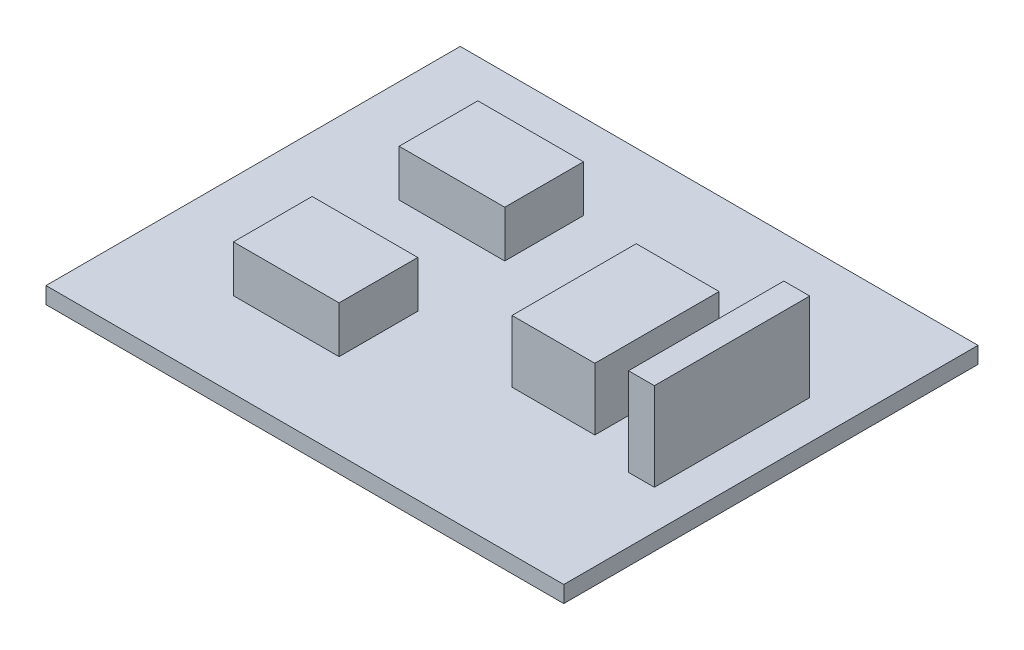
ISO-10303-21;
HEADER;
FILE_DESCRIPTION(('STEP AP214'),'2;1');
FILE_NAME('part.step','',(''),(''),'','','');
FILE_SCHEMA(('AUTOMOTIVE_DESIGN { 1 0 10303 214 1 1 1 1 }'));
ENDSEC;
DATA;
#1=APPLICATION_CONTEXT('core data for automotive mechanical design processes');
#2=APPLICATION_PROTOCOL_DEFINITION('international standard','automotive_design',2000,#1);
#3=PRODUCT_CONTEXT('',#1,'mechanical');
#4=PRODUCT('Part','Part','',(#3));
#5=PRODUCT_RELATED_PRODUCT_CATEGORY('part','',(#4));
#6=PRODUCT_DEFINITION_FORMATION('','',#4);
#7=PRODUCT_DEFINITION_CONTEXT('part definition',#1,'design');
#8=PRODUCT_DEFINITION('design','',#6,#7);
#9=PRODUCT_DEFINITION_SHAPE('','',#8);
#10=(LENGTH_UNIT() NAMED_UNIT(*) SI_UNIT(.MILLI.,.METRE.));
#11=(NAMED_UNIT(*) PLANE_ANGLE_UNIT() SI_UNIT($,.RADIAN.));
#12=(NAMED_UNIT(*) SI_UNIT($,.STERADIAN.) SOLID_ANGLE_UNIT());
#13=UNCERTAINTY_MEASURE_WITH_UNIT(LENGTH_MEASURE(1.E-05),#10,'distance_accuracy_value','');
#14=(GEOMETRIC_REPRESENTATION_CONTEXT(3) GLOBAL_UNCERTAINTY_ASSIGNED_CONTEXT((#13)) GLOBAL_UNIT_ASSIGNED_CONTEXT((#10,
#11,#12)) REPRESENTATION_CONTEXT('',''));
#15=CARTESIAN_POINT('',(0.,0.,0.));
#16=DIRECTION('',(0.,0.,1.));
#17=DIRECTION('',(1.,0.,0.));
#18=AXIS2_PLACEMENT_3D('',#15,#16,#17);
#19=CARTESIAN_POINT('',(0.,1.6,0.));
#20=DIRECTION('',(0.,-1.,0.));
#21=DIRECTION('',(0.,0.,-1.));
#22=AXIS2_PLACEMENT_3D('',#19,#20,#21);
#23=PLANE('',#22);
#24=DIRECTION('',(0.,0.,1.));
#25=VECTOR('',#24,1.);
#26=CARTESIAN_POINT('',(6.,1.6,-6.));
#27=LINE('',#26,#25);
#28=CARTESIAN_POINT('',(6.,1.6,-6.));
#29=VERTEX_POINT('',#28);
#30=CARTESIAN_POINT('',(6.,1.6,6.));
#31=VERTEX_POINT('',#30);
#32=EDGE_CURVE('E211',#29,#31,#27,.T.);
#33=ORIENTED_EDGE('',*,*,#32,.F.);
#34=DIRECTION('',(-1.,0.,0.));
#35=VECTOR('',#34,1.);
#36=CARTESIAN_POINT('',(14.,1.6,-6.));
#37=LINE('',#36,#35);
#38=CARTESIAN_POINT('',(14.,1.6,-6.));
#39=VERTEX_POINT('',#38);
#40=EDGE_CURVE('E229',#39,#29,#37,.T.);
#41=ORIENTED_EDGE('',*,*,#40,.F.);
#42=DIRECTION('',(0.,0.,-1.));
#43=VECTOR('',#42,1.);
#44=CARTESIAN_POINT('',(14.,1.6,6.));
#45=LINE('',#44,#43);
#46=CARTESIAN_POINT('',(14.,1.6,6.));
#47=VERTEX_POINT('',#46);
#48=EDGE_CURVE('E238',#47,#39,#45,.T.);
#49=ORIENTED_EDGE('',*,*,#48,.F.);
#50=DIRECTION('',(1.,0.,0.));
#51=VECTOR('',#50,1.);
#52=CARTESIAN_POINT('',(6.,1.6,6.));
#53=LINE('',#52,#51);
#54=EDGE_CURVE('E216',#31,#47,#53,.T.);
#55=ORIENTED_EDGE('',*,*,#54,.F.);
#56=EDGE_LOOP('',(#33,#41,#49,#55));
#57=FACE_BOUND('',#56,.T.);
#58=DIRECTION('',(0.,0.,1.));
#59=VECTOR('',#58,1.);
#60=CARTESIAN_POINT('',(-15.1,1.6,-11.8));
#61=LINE('',#60,#59);
#62=CARTESIAN_POINT('',(-15.1,1.6,-11.8));
#63=VERTEX_POINT('',#62);
#64=CARTESIAN_POINT('',(-15.1,1.6,-4.2));
#65=VERTEX_POINT('',#64);
#66=EDGE_CURVE('E307',#63,#65,#61,.T.);
#67=ORIENTED_EDGE('',*,*,#66,.F.);
#68=DIRECTION('',(-1.,0.,0.));
#69=VECTOR('',#68,1.);
#70=CARTESIAN_POINT('',(-4.9,1.6,-11.8));
#71=LINE('',#70,#69);
#72=CARTESIAN_POINT('',(-4.9,1.6,-11.8));
#73=VERTEX_POINT('',#72);
#74=EDGE_CURVE('E311',#73,#63,#71,.T.);
#75=ORIENTED_EDGE('',*,*,#74,.F.);
#76=DIRECTION('',(0.,0.,-1.));
#77=VECTOR('',#76,1.);
#78=CARTESIAN_POINT('',(-4.9,1.6,-4.2));
#79=LINE('',#78,#77);
#80=CARTESIAN_POINT('',(-4.9,1.6,-4.2));
#81=VERTEX_POINT('',#80);
#82=EDGE_CURVE('E329',#81,#73,#79,.T.);
#83=ORIENTED_EDGE('',*,*,#82,.F.);
#84=DIRECTION('',(1.,0.,0.));
#85=VECTOR('',#84,1.);
#86=CARTESIAN_POINT('',(-15.1,1.6,-4.2));
#87=LINE('',#86,#85);
#88=EDGE_CURVE('E326',#65,#81,#87,.T.);
#89=ORIENTED_EDGE('',*,*,#88,.F.);
#90=EDGE_LOOP('',(#67,#75,#83,#89));
#91=FACE_BOUND('',#90,.T.);
#92=DIRECTION('',(0.,0.,-1.));
#93=VECTOR('',#92,1.);
#94=CARTESIAN_POINT('',(25.,1.6,20.));
#95=LINE('',#94,#93);
#96=CARTESIAN_POINT('',(25.,1.6,20.));
#97=VERTEX_POINT('',#96);
#98=CARTESIAN_POINT('',(25.,1.6,-20.));
#99=VERTEX_POINT('',#98);
#100=EDGE_CURVE('E352',#97,#99,#95,.T.);
#101=ORIENTED_EDGE('',*,*,#100,.T.);
#102=DIRECTION('',(-1.,0.,0.));
#103=VECTOR('',#102,1.);
#104=CARTESIAN_POINT('',(-25.,1.6,-20.));
#105=LINE('',#104,#103);
#106=CARTESIAN_POINT('',(-25.,1.6,-20.));
#107=VERTEX_POINT('',#106);
#108=EDGE_CURVE('E359',#99,#107,#105,.T.);
#109=ORIENTED_EDGE('',*,*,#108,.T.);
#110=DIRECTION('',(0.,0.,1.));
#111=VECTOR('',#110,1.);
#112=CARTESIAN_POINT('',(-25.,1.6,20.));
#113=LINE('',#112,#111);
#114=CARTESIAN_POINT('',(-25.,1.6,20.));
#115=VERTEX_POINT('',#114);
#116=EDGE_CURVE('E363',#107,#115,#113,.T.);
#117=ORIENTED_EDGE('',*,*,#116,.T.);
#118=DIRECTION('',(1.,0.,0.));
#119=VECTOR('',#118,1.);
#120=CARTESIAN_POINT('',(-25.,1.6,20.));
#121=LINE('',#120,#119);
#122=EDGE_CURVE('E365',#115,#97,#121,.T.);
#123=ORIENTED_EDGE('',*,*,#122,.T.);
#124=EDGE_LOOP('',(#101,#109,#117,#123));
#125=FACE_BOUND('',#124,.T.);
#126=DIRECTION('',(0.,0.,1.));
#127=VECTOR('',#126,1.);
#128=CARTESIAN_POINT('',(-15.1,1.6,4.2));
#129=LINE('',#128,#127);
#130=CARTESIAN_POINT('',(-15.1,1.6,4.2));
#131=VERTEX_POINT('',#130);
#132=CARTESIAN_POINT('',(-15.1,1.6,11.8));
#133=VERTEX_POINT('',#132);
#134=EDGE_CURVE('E265',#131,#133,#129,.T.);
#135=ORIENTED_EDGE('',*,*,#134,.F.);
#136=DIRECTION('',(-1.,0.,0.));
#137=VECTOR('',#136,1.);
#138=CARTESIAN_POINT('',(-4.9,1.6,4.2));
#139=LINE('',#138,#137);
#140=CARTESIAN_POINT('',(-4.9,1.6,4.2));
#141=VERTEX_POINT('',#140);
#142=EDGE_CURVE('E268',#141,#131,#139,.T.);
#143=ORIENTED_EDGE('',*,*,#142,.F.);
#144=DIRECTION('',(0.,0.,-1.));
#145=VECTOR('',#144,1.);
#146=CARTESIAN_POINT('',(-4.9,1.6,11.8));
#147=LINE('',#146,#145);
#148=CARTESIAN_POINT('',(-4.9,1.6,11.8));
#149=VERTEX_POINT('',#148);
#150=EDGE_CURVE('E281',#149,#141,#147,.T.);
#151=ORIENTED_EDGE('',*,*,#150,.F.);
#152=DIRECTION('',(1.,0.,0.));
#153=VECTOR('',#152,1.);
#154=CARTESIAN_POINT('',(-15.1,1.6,11.8));
#155=LINE('',#154,#153);
#156=EDGE_CURVE('E283',#133,#149,#155,.T.);
#157=ORIENTED_EDGE('',*,*,#156,.F.);
#158=EDGE_LOOP('',(#135,#143,#151,#157));
#159=FACE_BOUND('',#158,.T.);
#160=DIRECTION('',(0.,0.,1.));
#161=VECTOR('',#160,1.);
#162=CARTESIAN_POINT('',(18.75,1.6,-7.5));
#163=LINE('',#162,#161);
#164=CARTESIAN_POINT('',(18.75,1.6,-7.5));
#165=VERTEX_POINT('',#164);
#166=CARTESIAN_POINT('',(18.75,1.6,7.5));
#167=VERTEX_POINT('',#166);
#168=EDGE_CURVE('E207',#165,#167,#163,.T.);
#169=ORIENTED_EDGE('',*,*,#168,.F.);
#170=DIRECTION('',(-1.,0.,0.));
#171=VECTOR('',#170,1.);
#172=CARTESIAN_POINT('',(21.25,1.6,-7.5));
#173=LINE('',#172,#171);
#174=CARTESIAN_POINT('',(21.25,1.6,-7.5));
#175=VERTEX_POINT('',#174);
#176=EDGE_CURVE('E206',#175,#165,#173,.T.);
#177=ORIENTED_EDGE('',*,*,#176,.F.);
#178=DIRECTION('',(0.,0.,-1.));
#179=VECTOR('',#178,1.);
#180=CARTESIAN_POINT('',(21.25,1.6,7.5));
#181=LINE('',#180,#179);
#182=CARTESIAN_POINT('',(21.25,1.6,7.5));
#183=VERTEX_POINT('',#182);
#184=EDGE_CURVE('E68',#183,#175,#181,.T.);
#185=ORIENTED_EDGE('',*,*,#184,.F.);
#186=DIRECTION('',(1.,0.,0.));
#187=VECTOR('',#186,1.);
#188=CARTESIAN_POINT('',(18.75,1.6,7.5));
#189=LINE('',#188,#187);
#190=EDGE_CURVE('E61',#167,#183,#189,.T.);
#191=ORIENTED_EDGE('',*,*,#190,.F.);
#192=EDGE_LOOP('',(#169,#177,#185,#191));
#193=FACE_BOUND('',#192,.T.);
#194=ADVANCED_FACE('F47',(#57,#91,#125,#159,#193),#23,.F.);
#195=CARTESIAN_POINT('',(25.,1.6,20.));
#196=DIRECTION('',(-1.,0.,0.));
#197=DIRECTION('',(0.,0.,1.));
#198=AXIS2_PLACEMENT_3D('',#195,#196,#197);
#199=PLANE('',#198);
#200=DIRECTION('',(0.,0.,-1.));
#201=VECTOR('',#200,1.);
#202=CARTESIAN_POINT('',(25.,0.,20.));
#203=LINE('',#202,#201);
#204=CARTESIAN_POINT('',(25.,0.,20.));
#205=VERTEX_POINT('',#204);
#206=CARTESIAN_POINT('',(25.,0.,-20.));
#207=VERTEX_POINT('',#206);
#208=EDGE_CURVE('E354',#205,#207,#203,.T.);
#209=ORIENTED_EDGE('',*,*,#208,.T.);
#210=DIRECTION('',(0.,-1.,0.));
#211=VECTOR('',#210,1.);
#212=CARTESIAN_POINT('',(25.,1.6,-20.));
#213=LINE('',#212,#211);
#214=EDGE_CURVE('E11',#99,#207,#213,.T.);
#215=ORIENTED_EDGE('',*,*,#214,.F.);
#216=ORIENTED_EDGE('',*,*,#100,.F.);
#217=DIRECTION('',(0.,-1.,0.));
#218=VECTOR('',#217,1.);
#219=CARTESIAN_POINT('',(25.,1.6,20.));
#220=LINE('',#219,#218);
#221=EDGE_CURVE('E370',#97,#205,#220,.T.);
#222=ORIENTED_EDGE('',*,*,#221,.T.);
#223=EDGE_LOOP('',(#209,#215,#216,#222));
#224=FACE_BOUND('',#223,.T.);
#225=ADVANCED_FACE('F51',(#224),#199,.F.);
#226=CARTESIAN_POINT('',(-25.,1.6,-20.));
#227=DIRECTION('',(0.,0.,1.));
#228=DIRECTION('',(1.,0.,0.));
#229=AXIS2_PLACEMENT_3D('',#226,#227,#228);
#230=PLANE('',#229);
#231=DIRECTION('',(-1.,0.,0.));
#232=VECTOR('',#231,1.);
#233=CARTESIAN_POINT('',(-25.,0.,-20.));
#234=LINE('',#233,#232);
#235=CARTESIAN_POINT('',(-25.,0.,-20.));
#236=VERTEX_POINT('',#235);
#237=EDGE_CURVE('E371',#207,#236,#234,.T.);
#238=ORIENTED_EDGE('',*,*,#237,.T.);
#239=DIRECTION('',(0.,-1.,0.));
#240=VECTOR('',#239,1.);
#241=CARTESIAN_POINT('',(-25.,1.6,-20.));
#242=LINE('',#241,#240);
#243=EDGE_CURVE('E59',#107,#236,#242,.T.);
#244=ORIENTED_EDGE('',*,*,#243,.F.);
#245=ORIENTED_EDGE('',*,*,#108,.F.);
#246=ORIENTED_EDGE('',*,*,#214,.T.);
#247=EDGE_LOOP('',(#238,#244,#245,#246));
#248=FACE_BOUND('',#247,.T.);
#249=ADVANCED_FACE('F409',(#248),#230,.F.);
#250=CARTESIAN_POINT('',(-25.,1.6,20.));
#251=DIRECTION('',(1.,0.,0.));
#252=DIRECTION('',(0.,0.,-1.));
#253=AXIS2_PLACEMENT_3D('',#250,#251,#252);
#254=PLANE('',#253);
#255=DIRECTION('',(0.,0.,1.));
#256=VECTOR('',#255,1.);
#257=CARTESIAN_POINT('',(-25.,0.,20.));
#258=LINE('',#257,#256);
#259=CARTESIAN_POINT('',(-25.,0.,20.));
#260=VERTEX_POINT('',#259);
#261=EDGE_CURVE('E372',#236,#260,#258,.T.);
#262=ORIENTED_EDGE('',*,*,#261,.T.);
#263=DIRECTION('',(0.,-1.,0.));
#264=VECTOR('',#263,1.);
#265=CARTESIAN_POINT('',(-25.,1.6,20.));
#266=LINE('',#265,#264);
#267=EDGE_CURVE('E385',#115,#260,#266,.T.);
#268=ORIENTED_EDGE('',*,*,#267,.F.);
#269=ORIENTED_EDGE('',*,*,#116,.F.);
#270=ORIENTED_EDGE('',*,*,#243,.T.);
#271=EDGE_LOOP('',(#262,#268,#269,#270));
#272=FACE_BOUND('',#271,.T.);
#273=ADVANCED_FACE('F393',(#272),#254,.F.);
#274=CARTESIAN_POINT('',(-25.,1.6,20.));
#275=DIRECTION('',(0.,0.,-1.));
#276=DIRECTION('',(-1.,0.,0.));
#277=AXIS2_PLACEMENT_3D('',#274,#275,#276);
#278=PLANE('',#277);
#279=DIRECTION('',(1.,0.,0.));
#280=VECTOR('',#279,1.);
#281=CARTESIAN_POINT('',(-25.,0.,20.));
#282=LINE('',#281,#280);
#283=EDGE_CURVE('E360',#260,#205,#282,.T.);
#284=ORIENTED_EDGE('',*,*,#283,.T.);
#285=ORIENTED_EDGE('',*,*,#221,.F.);
#286=ORIENTED_EDGE('',*,*,#122,.F.);
#287=ORIENTED_EDGE('',*,*,#267,.T.);
#288=EDGE_LOOP('',(#284,#285,#286,#287));
#289=FACE_BOUND('',#288,.T.);
#290=ADVANCED_FACE('F398',(#289),#278,.F.);
#291=CARTESIAN_POINT('',(0.,0.,0.));
#292=DIRECTION('',(0.,-1.,0.));
#293=DIRECTION('',(0.,0.,-1.));
#294=AXIS2_PLACEMENT_3D('',#291,#292,#293);
#295=PLANE('',#294);
#296=ORIENTED_EDGE('',*,*,#208,.F.);
#297=ORIENTED_EDGE('',*,*,#283,.F.);
#298=ORIENTED_EDGE('',*,*,#261,.F.);
#299=ORIENTED_EDGE('',*,*,#237,.F.);
#300=EDGE_LOOP('',(#296,#297,#298,#299));
#301=FACE_BOUND('',#300,.T.);
#302=ADVANCED_FACE('F399',(#301),#295,.T.);
#303=CARTESIAN_POINT('',(-15.1,6.1,-11.8));
#304=DIRECTION('',(1.,0.,0.));
#305=DIRECTION('',(0.,0.,-1.));
#306=AXIS2_PLACEMENT_3D('',#303,#304,#305);
#307=PLANE('',#306);
#308=ORIENTED_EDGE('',*,*,#66,.T.);
#309=DIRECTION('',(0.,-1.,0.));
#310=VECTOR('',#309,1.);
#311=CARTESIAN_POINT('',(-15.1,6.1,-4.2));
#312=LINE('',#311,#310);
#313=CARTESIAN_POINT('',(-15.1,6.1,-4.2));
#314=VERTEX_POINT('',#313);
#315=EDGE_CURVE('E346',#314,#65,#312,.T.);
#316=ORIENTED_EDGE('',*,*,#315,.F.);
#317=DIRECTION('',(0.,0.,1.));
#318=VECTOR('',#317,1.);
#319=CARTESIAN_POINT('',(-15.1,6.1,-11.8));
#320=LINE('',#319,#318);
#321=CARTESIAN_POINT('',(-15.1,6.1,-11.8));
#322=VERTEX_POINT('',#321);
#323=EDGE_CURVE('E306',#322,#314,#320,.T.);
#324=ORIENTED_EDGE('',*,*,#323,.F.);
#325=DIRECTION('',(0.,-1.,0.));
#326=VECTOR('',#325,1.);
#327=CARTESIAN_POINT('',(-15.1,6.1,-11.8));
#328=LINE('',#327,#326);
#329=EDGE_CURVE('E325',#322,#63,#328,.T.);
#330=ORIENTED_EDGE('',*,*,#329,.T.);
#331=EDGE_LOOP('',(#308,#316,#324,#330));
#332=FACE_BOUND('',#331,.T.);
#333=ADVANCED_FACE('F424',(#332),#307,.F.);
#334=CARTESIAN_POINT('',(-15.1,6.1,-4.2));
#335=DIRECTION('',(0.,0.,-1.));
#336=DIRECTION('',(-1.,0.,0.));
#337=AXIS2_PLACEMENT_3D('',#334,#335,#336);
#338=PLANE('',#337);
#339=ORIENTED_EDGE('',*,*,#88,.T.);
#340=DIRECTION('',(0.,-1.,0.));
#341=VECTOR('',#340,1.);
#342=CARTESIAN_POINT('',(-4.9,6.1,-4.2));
#343=LINE('',#342,#341);
#344=CARTESIAN_POINT('',(-4.9,6.1,-4.2));
#345=VERTEX_POINT('',#344);
#346=EDGE_CURVE('E341',#345,#81,#343,.T.);
#347=ORIENTED_EDGE('',*,*,#346,.F.);
#348=DIRECTION('',(1.,0.,0.));
#349=VECTOR('',#348,1.);
#350=CARTESIAN_POINT('',(-15.1,6.1,-4.2));
#351=LINE('',#350,#349);
#352=EDGE_CURVE('E315',#314,#345,#351,.T.);
#353=ORIENTED_EDGE('',*,*,#352,.F.);
#354=ORIENTED_EDGE('',*,*,#315,.T.);
#355=EDGE_LOOP('',(#339,#347,#353,#354));
#356=FACE_BOUND('',#355,.T.);
#357=ADVANCED_FACE('F449',(#356),#338,.F.);
#358=CARTESIAN_POINT('',(-4.9,6.1,-4.2));
#359=DIRECTION('',(-1.,0.,0.));
#360=DIRECTION('',(0.,0.,1.));
#361=AXIS2_PLACEMENT_3D('',#358,#359,#360);
#362=PLANE('',#361);
#363=ORIENTED_EDGE('',*,*,#82,.T.);
#364=DIRECTION('',(0.,-1.,0.));
#365=VECTOR('',#364,1.);
#366=CARTESIAN_POINT('',(-4.9,6.1,-11.8));
#367=LINE('',#366,#365);
#368=CARTESIAN_POINT('',(-4.9,6.1,-11.8));
#369=VERTEX_POINT('',#368);
#370=EDGE_CURVE('E336',#369,#73,#367,.T.);
#371=ORIENTED_EDGE('',*,*,#370,.F.);
#372=DIRECTION('',(0.,0.,-1.));
#373=VECTOR('',#372,1.);
#374=CARTESIAN_POINT('',(-4.9,6.1,-4.2));
#375=LINE('',#374,#373);
#376=EDGE_CURVE('E316',#345,#369,#375,.T.);
#377=ORIENTED_EDGE('',*,*,#376,.F.);
#378=ORIENTED_EDGE('',*,*,#346,.T.);
#379=EDGE_LOOP('',(#363,#371,#377,#378));
#380=FACE_BOUND('',#379,.T.);
#381=ADVANCED_FACE('F456',(#380),#362,.F.);
#382=CARTESIAN_POINT('',(-4.9,6.1,-11.8));
#383=DIRECTION('',(0.,0.,1.));
#384=DIRECTION('',(1.,0.,0.));
#385=AXIS2_PLACEMENT_3D('',#382,#383,#384);
#386=PLANE('',#385);
#387=ORIENTED_EDGE('',*,*,#74,.T.);
#388=ORIENTED_EDGE('',*,*,#329,.F.);
#389=DIRECTION('',(-1.,0.,0.));
#390=VECTOR('',#389,1.);
#391=CARTESIAN_POINT('',(-4.9,6.1,-11.8));
#392=LINE('',#391,#390);
#393=EDGE_CURVE('E317',#369,#322,#392,.T.);
#394=ORIENTED_EDGE('',*,*,#393,.F.);
#395=ORIENTED_EDGE('',*,*,#370,.T.);
#396=EDGE_LOOP('',(#387,#388,#394,#395));
#397=FACE_BOUND('',#396,.T.);
#398=ADVANCED_FACE('F466',(#397),#386,.F.);
#399=CARTESIAN_POINT('',(0.,6.1,0.));
#400=DIRECTION('',(0.,1.,0.));
#401=DIRECTION('',(0.,0.,1.));
#402=AXIS2_PLACEMENT_3D('',#399,#400,#401);
#403=PLANE('',#402);
#404=ORIENTED_EDGE('',*,*,#323,.T.);
#405=ORIENTED_EDGE('',*,*,#352,.T.);
#406=ORIENTED_EDGE('',*,*,#376,.T.);
#407=ORIENTED_EDGE('',*,*,#393,.T.);
#408=EDGE_LOOP('',(#404,#405,#406,#407));
#409=FACE_BOUND('',#408,.T.);
#410=ADVANCED_FACE('F481',(#409),#403,.T.);
#411=CARTESIAN_POINT('',(-15.1,6.1,4.2));
#412=DIRECTION('',(1.,0.,0.));
#413=DIRECTION('',(0.,0.,-1.));
#414=AXIS2_PLACEMENT_3D('',#411,#412,#413);
#415=PLANE('',#414);
#416=ORIENTED_EDGE('',*,*,#134,.T.);
#417=DIRECTION('',(0.,-1.,0.));
#418=VECTOR('',#417,1.);
#419=CARTESIAN_POINT('',(-15.1,6.1,11.8));
#420=LINE('',#419,#418);
#421=CARTESIAN_POINT('',(-15.1,6.1,11.8));
#422=VERTEX_POINT('',#421);
#423=EDGE_CURVE('E305',#422,#133,#420,.T.);
#424=ORIENTED_EDGE('',*,*,#423,.F.);
#425=DIRECTION('',(0.,0.,1.));
#426=VECTOR('',#425,1.);
#427=CARTESIAN_POINT('',(-15.1,6.1,4.2));
#428=LINE('',#427,#426);
#429=CARTESIAN_POINT('',(-15.1,6.1,4.2));
#430=VERTEX_POINT('',#429);
#431=EDGE_CURVE('E263',#430,#422,#428,.T.);
#432=ORIENTED_EDGE('',*,*,#431,.F.);
#433=DIRECTION('',(0.,-1.,0.));
#434=VECTOR('',#433,1.);
#435=CARTESIAN_POINT('',(-15.1,6.1,4.2));
#436=LINE('',#435,#434);
#437=EDGE_CURVE('E280',#430,#131,#436,.T.);
#438=ORIENTED_EDGE('',*,*,#437,.T.);
#439=EDGE_LOOP('',(#416,#424,#432,#438));
#440=FACE_BOUND('',#439,.T.);
#441=ADVANCED_FACE('F492',(#440),#415,.F.);
#442=CARTESIAN_POINT('',(-15.1,6.1,11.8));
#443=DIRECTION('',(0.,0.,-1.));
#444=DIRECTION('',(-1.,0.,0.));
#445=AXIS2_PLACEMENT_3D('',#442,#443,#444);
#446=PLANE('',#445);
#447=ORIENTED_EDGE('',*,*,#156,.T.);
#448=DIRECTION('',(0.,-1.,0.));
#449=VECTOR('',#448,1.);
#450=CARTESIAN_POINT('',(-4.9,6.1,11.8));
#451=LINE('',#450,#449);
#452=CARTESIAN_POINT('',(-4.9,6.1,11.8));
#453=VERTEX_POINT('',#452);
#454=EDGE_CURVE('E300',#453,#149,#451,.T.);
#455=ORIENTED_EDGE('',*,*,#454,.F.);
#456=DIRECTION('',(1.,0.,0.));
#457=VECTOR('',#456,1.);
#458=CARTESIAN_POINT('',(-15.1,6.1,11.8));
#459=LINE('',#458,#457);
#460=EDGE_CURVE('E270',#422,#453,#459,.T.);
#461=ORIENTED_EDGE('',*,*,#460,.F.);
#462=ORIENTED_EDGE('',*,*,#423,.T.);
#463=EDGE_LOOP('',(#447,#455,#461,#462));
#464=FACE_BOUND('',#463,.T.);
#465=ADVANCED_FACE('F501',(#464),#446,.F.);
#466=CARTESIAN_POINT('',(-4.9,6.1,11.8));
#467=DIRECTION('',(-1.,0.,0.));
#468=DIRECTION('',(0.,0.,1.));
#469=AXIS2_PLACEMENT_3D('',#466,#467,#468);
#470=PLANE('',#469);
#471=ORIENTED_EDGE('',*,*,#150,.T.);
#472=DIRECTION('',(0.,-1.,0.));
#473=VECTOR('',#472,1.);
#474=CARTESIAN_POINT('',(-4.9,6.1,4.2));
#475=LINE('',#474,#473);
#476=CARTESIAN_POINT('',(-4.9,6.1,4.2));
#477=VERTEX_POINT('',#476);
#478=EDGE_CURVE('E293',#477,#141,#475,.T.);
#479=ORIENTED_EDGE('',*,*,#478,.F.);
#480=DIRECTION('',(0.,0.,-1.));
#481=VECTOR('',#480,1.);
#482=CARTESIAN_POINT('',(-4.9,6.1,11.8));
#483=LINE('',#482,#481);
#484=EDGE_CURVE('E271',#453,#477,#483,.T.);
#485=ORIENTED_EDGE('',*,*,#484,.F.);
#486=ORIENTED_EDGE('',*,*,#454,.T.);
#487=EDGE_LOOP('',(#471,#479,#485,#486));
#488=FACE_BOUND('',#487,.T.);
#489=ADVANCED_FACE('F519',(#488),#470,.F.);
#490=CARTESIAN_POINT('',(-4.9,6.1,4.2));
#491=DIRECTION('',(0.,0.,1.));
#492=DIRECTION('',(1.,0.,0.));
#493=AXIS2_PLACEMENT_3D('',#490,#491,#492);
#494=PLANE('',#493);
#495=ORIENTED_EDGE('',*,*,#142,.T.);
#496=ORIENTED_EDGE('',*,*,#437,.F.);
#497=DIRECTION('',(-1.,0.,0.));
#498=VECTOR('',#497,1.);
#499=CARTESIAN_POINT('',(-4.9,6.1,4.2));
#500=LINE('',#499,#498);
#501=EDGE_CURVE('E273',#477,#430,#500,.T.);
#502=ORIENTED_EDGE('',*,*,#501,.F.);
#503=ORIENTED_EDGE('',*,*,#478,.T.);
#504=EDGE_LOOP('',(#495,#496,#502,#503));
#505=FACE_BOUND('',#504,.T.);
#506=ADVANCED_FACE('F530',(#505),#494,.F.);
#507=CARTESIAN_POINT('',(0.,6.1,0.));
#508=DIRECTION('',(0.,1.,0.));
#509=DIRECTION('',(0.,0.,1.));
#510=AXIS2_PLACEMENT_3D('',#507,#508,#509);
#511=PLANE('',#510);
#512=ORIENTED_EDGE('',*,*,#431,.T.);
#513=ORIENTED_EDGE('',*,*,#460,.T.);
#514=ORIENTED_EDGE('',*,*,#484,.T.);
#515=ORIENTED_EDGE('',*,*,#501,.T.);
#516=EDGE_LOOP('',(#512,#513,#514,#515));
#517=FACE_BOUND('',#516,.T.);
#518=ADVANCED_FACE('F541',(#517),#511,.T.);
#519=CARTESIAN_POINT('',(6.,7.6,-6.));
#520=DIRECTION('',(1.,0.,0.));
#521=DIRECTION('',(0.,0.,-1.));
#522=AXIS2_PLACEMENT_3D('',#519,#520,#521);
#523=PLANE('',#522);
#524=ORIENTED_EDGE('',*,*,#32,.T.);
#525=DIRECTION('',(0.,-1.,0.));
#526=VECTOR('',#525,1.);
#527=CARTESIAN_POINT('',(6.,7.6,6.));
#528=LINE('',#527,#526);
#529=CARTESIAN_POINT('',(6.,7.6,6.));
#530=VERTEX_POINT('',#529);
#531=EDGE_CURVE('E256',#530,#31,#528,.T.);
#532=ORIENTED_EDGE('',*,*,#531,.F.);
#533=DIRECTION('',(0.,0.,1.));
#534=VECTOR('',#533,1.);
#535=CARTESIAN_POINT('',(6.,7.6,-6.));
#536=LINE('',#535,#534);
#537=CARTESIAN_POINT('',(6.,7.6,-6.));
#538=VERTEX_POINT('',#537);
#539=EDGE_CURVE('E225',#538,#530,#536,.T.);
#540=ORIENTED_EDGE('',*,*,#539,.F.);
#541=DIRECTION('',(0.,-1.,0.));
#542=VECTOR('',#541,1.);
#543=CARTESIAN_POINT('',(6.,7.6,-6.));
#544=LINE('',#543,#542);
#545=EDGE_CURVE('E233',#538,#29,#544,.T.);
#546=ORIENTED_EDGE('',*,*,#545,.T.);
#547=EDGE_LOOP('',(#524,#532,#540,#546));
#548=FACE_BOUND('',#547,.T.);
#549=ADVANCED_FACE('F554',(#548),#523,.F.);
#550=CARTESIAN_POINT('',(6.,7.6,6.));
#551=DIRECTION('',(0.,0.,-1.));
#552=DIRECTION('',(-1.,0.,0.));
#553=AXIS2_PLACEMENT_3D('',#550,#551,#552);
#554=PLANE('',#553);
#555=ORIENTED_EDGE('',*,*,#54,.T.);
#556=DIRECTION('',(0.,-1.,0.));
#557=VECTOR('',#556,1.);
#558=CARTESIAN_POINT('',(14.,7.6,6.));
#559=LINE('',#558,#557);
#560=CARTESIAN_POINT('',(14.,7.6,6.));
#561=VERTEX_POINT('',#560);
#562=EDGE_CURVE('E255',#561,#47,#559,.T.);
#563=ORIENTED_EDGE('',*,*,#562,.F.);
#564=DIRECTION('',(1.,0.,0.));
#565=VECTOR('',#564,1.);
#566=CARTESIAN_POINT('',(6.,7.6,6.));
#567=LINE('',#566,#565);
#568=EDGE_CURVE('E228',#530,#561,#567,.T.);
#569=ORIENTED_EDGE('',*,*,#568,.F.);
#570=ORIENTED_EDGE('',*,*,#531,.T.);
#571=EDGE_LOOP('',(#555,#563,#569,#570));
#572=FACE_BOUND('',#571,.T.);
#573=ADVANCED_FACE('F563',(#572),#554,.F.);
#574=CARTESIAN_POINT('',(14.,7.6,6.));
#575=DIRECTION('',(-1.,0.,0.));
#576=DIRECTION('',(0.,0.,1.));
#577=AXIS2_PLACEMENT_3D('',#574,#575,#576);
#578=PLANE('',#577);
#579=ORIENTED_EDGE('',*,*,#48,.T.);
#580=DIRECTION('',(0.,-1.,0.));
#581=VECTOR('',#580,1.);
#582=CARTESIAN_POINT('',(14.,7.6,-6.));
#583=LINE('',#582,#581);
#584=CARTESIAN_POINT('',(14.,7.6,-6.));
#585=VERTEX_POINT('',#584);
#586=EDGE_CURVE('E248',#585,#39,#583,.T.);
#587=ORIENTED_EDGE('',*,*,#586,.F.);
#588=DIRECTION('',(0.,0.,-1.));
#589=VECTOR('',#588,1.);
#590=CARTESIAN_POINT('',(14.,7.6,6.));
#591=LINE('',#590,#589);
#592=EDGE_CURVE('E226',#561,#585,#591,.T.);
#593=ORIENTED_EDGE('',*,*,#592,.F.);
#594=ORIENTED_EDGE('',*,*,#562,.T.);
#595=EDGE_LOOP('',(#579,#587,#593,#594));
#596=FACE_BOUND('',#595,.T.);
#597=ADVANCED_FACE('F579',(#596),#578,.F.);
#598=CARTESIAN_POINT('',(14.,7.6,-6.));
#599=DIRECTION('',(0.,0.,1.));
#600=DIRECTION('',(1.,0.,0.));
#601=AXIS2_PLACEMENT_3D('',#598,#599,#600);
#602=PLANE('',#601);
#603=ORIENTED_EDGE('',*,*,#40,.T.);
#604=ORIENTED_EDGE('',*,*,#545,.F.);
#605=DIRECTION('',(-1.,0.,0.));
#606=VECTOR('',#605,1.);
#607=CARTESIAN_POINT('',(14.,7.6,-6.));
#608=LINE('',#607,#606);
#609=EDGE_CURVE('E235',#585,#538,#608,.T.);
#610=ORIENTED_EDGE('',*,*,#609,.F.);
#611=ORIENTED_EDGE('',*,*,#586,.T.);
#612=EDGE_LOOP('',(#603,#604,#610,#611));
#613=FACE_BOUND('',#612,.T.);
#614=ADVANCED_FACE('F589',(#613),#602,.F.);
#615=CARTESIAN_POINT('',(0.,7.6,0.));
#616=DIRECTION('',(0.,1.,0.));
#617=DIRECTION('',(0.,0.,1.));
#618=AXIS2_PLACEMENT_3D('',#615,#616,#617);
#619=PLANE('',#618);
#620=ORIENTED_EDGE('',*,*,#539,.T.);
#621=ORIENTED_EDGE('',*,*,#568,.T.);
#622=ORIENTED_EDGE('',*,*,#592,.T.);
#623=ORIENTED_EDGE('',*,*,#609,.T.);
#624=EDGE_LOOP('',(#620,#621,#622,#623));
#625=FACE_BOUND('',#624,.T.);
#626=ADVANCED_FACE('F599',(#625),#619,.T.);
#627=CARTESIAN_POINT('',(18.75,10.1,-7.5));
#628=DIRECTION('',(1.,0.,0.));
#629=DIRECTION('',(0.,0.,-1.));
#630=AXIS2_PLACEMENT_3D('',#627,#628,#629);
#631=PLANE('',#630);
#632=ORIENTED_EDGE('',*,*,#168,.T.);
#633=DIRECTION('',(0.,-1.,0.));
#634=VECTOR('',#633,1.);
#635=CARTESIAN_POINT('',(18.75,10.1,7.5));
#636=LINE('',#635,#634);
#637=CARTESIAN_POINT('',(18.75,10.1,7.5));
#638=VERTEX_POINT('',#637);
#639=EDGE_CURVE('E187',#638,#167,#636,.T.);
#640=ORIENTED_EDGE('',*,*,#639,.F.);
#641=DIRECTION('',(0.,0.,1.));
#642=VECTOR('',#641,1.);
#643=CARTESIAN_POINT('',(18.75,10.1,-7.5));
#644=LINE('',#643,#642);
#645=CARTESIAN_POINT('',(18.75,10.1,-7.5));
#646=VERTEX_POINT('',#645);
#647=EDGE_CURVE('E198',#646,#638,#644,.T.);
#648=ORIENTED_EDGE('',*,*,#647,.F.);
#649=DIRECTION('',(0.,-1.,0.));
#650=VECTOR('',#649,1.);
#651=CARTESIAN_POINT('',(18.75,10.1,-7.5));
#652=LINE('',#651,#650);
#653=EDGE_CURVE('E719',#646,#165,#652,.T.);
#654=ORIENTED_EDGE('',*,*,#653,.T.);
#655=EDGE_LOOP('',(#632,#640,#648,#654));
#656=FACE_BOUND('',#655,.T.);
#657=ADVANCED_FACE('F208',(#656),#631,.F.);
#658=CARTESIAN_POINT('',(18.75,10.1,7.5));
#659=DIRECTION('',(0.,0.,-1.));
#660=DIRECTION('',(-1.,0.,0.));
#661=AXIS2_PLACEMENT_3D('',#658,#659,#660);
#662=PLANE('',#661);
#663=ORIENTED_EDGE('',*,*,#190,.T.);
#664=DIRECTION('',(0.,-1.,0.));
#665=VECTOR('',#664,1.);
#666=CARTESIAN_POINT('',(21.25,10.1,7.5));
#667=LINE('',#666,#665);
#668=CARTESIAN_POINT('',(21.25,10.1,7.5));
#669=VERTEX_POINT('',#668);
#670=EDGE_CURVE('E192',#669,#183,#667,.T.);
#671=ORIENTED_EDGE('',*,*,#670,.F.);
#672=DIRECTION('',(1.,0.,0.));
#673=VECTOR('',#672,1.);
#674=CARTESIAN_POINT('',(18.75,10.1,7.5));
#675=LINE('',#674,#673);
#676=EDGE_CURVE('E184',#638,#669,#675,.T.);
#677=ORIENTED_EDGE('',*,*,#676,.F.);
#678=ORIENTED_EDGE('',*,*,#639,.T.);
#679=EDGE_LOOP('',(#663,#671,#677,#678));
#680=FACE_BOUND('',#679,.T.);
#681=ADVANCED_FACE('F188',(#680),#662,.F.);
#682=CARTESIAN_POINT('',(21.25,10.1,7.5));
#683=DIRECTION('',(-1.,0.,0.));
#684=DIRECTION('',(0.,0.,1.));
#685=AXIS2_PLACEMENT_3D('',#682,#683,#684);
#686=PLANE('',#685);
#687=ORIENTED_EDGE('',*,*,#184,.T.);
#688=DIRECTION('',(0.,-1.,0.));
#689=VECTOR('',#688,1.);
#690=CARTESIAN_POINT('',(21.25,10.1,-7.5));
#691=LINE('',#690,#689);
#692=CARTESIAN_POINT('',(21.25,10.1,-7.5));
#693=VERTEX_POINT('',#692);
#694=EDGE_CURVE('E217',#693,#175,#691,.T.);
#695=ORIENTED_EDGE('',*,*,#694,.F.);
#696=DIRECTION('',(0.,0.,-1.));
#697=VECTOR('',#696,1.);
#698=CARTESIAN_POINT('',(21.25,10.1,7.5));
#699=LINE('',#698,#697);
#700=EDGE_CURVE('E193',#669,#693,#699,.T.);
#701=ORIENTED_EDGE('',*,*,#700,.F.);
#702=ORIENTED_EDGE('',*,*,#670,.T.);
#703=EDGE_LOOP('',(#687,#695,#701,#702));
#704=FACE_BOUND('',#703,.T.);
#705=ADVANCED_FACE('F626',(#704),#686,.F.);
#706=CARTESIAN_POINT('',(21.25,10.1,-7.5));
#707=DIRECTION('',(0.,0.,1.));
#708=DIRECTION('',(1.,0.,0.));
#709=AXIS2_PLACEMENT_3D('',#706,#707,#708);
#710=PLANE('',#709);
#711=ORIENTED_EDGE('',*,*,#176,.T.);
#712=ORIENTED_EDGE('',*,*,#653,.F.);
#713=DIRECTION('',(-1.,0.,0.));
#714=VECTOR('',#713,1.);
#715=CARTESIAN_POINT('',(21.25,10.1,-7.5));
#716=LINE('',#715,#714);
#717=EDGE_CURVE('E203',#693,#646,#716,.T.);
#718=ORIENTED_EDGE('',*,*,#717,.F.);
#719=ORIENTED_EDGE('',*,*,#694,.T.);
#720=EDGE_LOOP('',(#711,#712,#718,#719));
#721=FACE_BOUND('',#720,.T.);
#722=ADVANCED_FACE('F640',(#721),#710,.F.);
#723=CARTESIAN_POINT('',(0.,10.1,0.));
#724=DIRECTION('',(0.,1.,0.));
#725=DIRECTION('',(0.,0.,1.));
#726=AXIS2_PLACEMENT_3D('',#723,#724,#725);
#727=PLANE('',#726);
#728=ORIENTED_EDGE('',*,*,#647,.T.);
#729=ORIENTED_EDGE('',*,*,#676,.T.);
#730=ORIENTED_EDGE('',*,*,#700,.T.);
#731=ORIENTED_EDGE('',*,*,#717,.T.);
#732=EDGE_LOOP('',(#728,#729,#730,#731));
#733=FACE_BOUND('',#732,.T.);
#734=ADVANCED_FACE('F200',(#733),#727,.T.);
#735=CLOSED_SHELL('',(#194,#225,#249,#273,#290,#302,#333,#357,#381,#398,#410,#441,#465,#489,
#506,#518,#549,#573,#597,#614,#626,#657,#681,#705,#722,#734));
#736=MANIFOLD_SOLID_BREP('B2',#735);
#737=ADVANCED_BREP_SHAPE_REPRESENTATION('',(#18,#736),#14);
#738=SHAPE_DEFINITION_REPRESENTATION(#9,#737);
ENDSEC;
END-ISO-10303-21;
